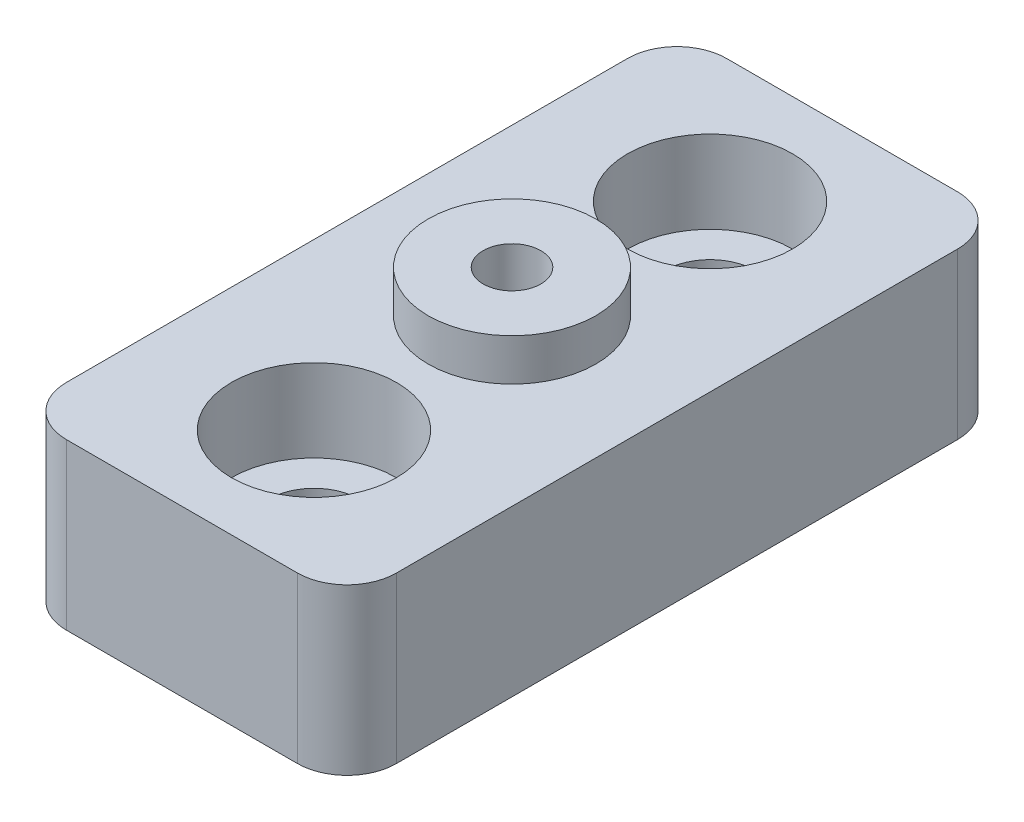
ISO-10303-21;
HEADER;
FILE_DESCRIPTION(('STEP AP214'),'2;1');
FILE_NAME('part.step','',(''),(''),'','','');
FILE_SCHEMA(('AUTOMOTIVE_DESIGN { 1 0 10303 214 1 1 1 1 }'));
ENDSEC;
DATA;
#1=APPLICATION_CONTEXT('core data for automotive mechanical design processes');
#2=APPLICATION_PROTOCOL_DEFINITION('international standard','automotive_design',2000,#1);
#3=PRODUCT_CONTEXT('',#1,'mechanical');
#4=PRODUCT('Part','Part','',(#3));
#5=PRODUCT_RELATED_PRODUCT_CATEGORY('part','',(#4));
#6=PRODUCT_DEFINITION_FORMATION('','',#4);
#7=PRODUCT_DEFINITION_CONTEXT('part definition',#1,'design');
#8=PRODUCT_DEFINITION('design','',#6,#7);
#9=PRODUCT_DEFINITION_SHAPE('','',#8);
#10=(LENGTH_UNIT() NAMED_UNIT(*) SI_UNIT(.MILLI.,.METRE.));
#11=(NAMED_UNIT(*) PLANE_ANGLE_UNIT() SI_UNIT($,.RADIAN.));
#12=(NAMED_UNIT(*) SI_UNIT($,.STERADIAN.) SOLID_ANGLE_UNIT());
#13=UNCERTAINTY_MEASURE_WITH_UNIT(LENGTH_MEASURE(1.E-05),#10,'distance_accuracy_value','');
#14=(GEOMETRIC_REPRESENTATION_CONTEXT(3) GLOBAL_UNCERTAINTY_ASSIGNED_CONTEXT((#13)) GLOBAL_UNIT_ASSIGNED_CONTEXT((#10,
#11,#12)) REPRESENTATION_CONTEXT('',''));
#15=CARTESIAN_POINT('',(0.,0.,0.));
#16=DIRECTION('',(0.,0.,1.));
#17=DIRECTION('',(1.,0.,0.));
#18=AXIS2_PLACEMENT_3D('',#15,#16,#17);
#19=CARTESIAN_POINT('',(10.,10.,-20.));
#20=DIRECTION('',(-1.,0.,0.));
#21=DIRECTION('',(0.,0.,1.));
#22=AXIS2_PLACEMENT_3D('',#19,#20,#21);
#23=PLANE('',#22);
#24=DIRECTION('',(0.,0.,-1.));
#25=VECTOR('',#24,1.);
#26=CARTESIAN_POINT('',(10.,10.,-20.));
#27=LINE('',#26,#25);
#28=CARTESIAN_POINT('',(10.,10.,17.));
#29=VERTEX_POINT('',#28);
#30=CARTESIAN_POINT('',(10.,10.,-17.));
#31=VERTEX_POINT('',#30);
#32=EDGE_CURVE('E201',#29,#31,#27,.T.);
#33=ORIENTED_EDGE('',*,*,#32,.F.);
#34=DIRECTION('',(0.,-1.,0.));
#35=VECTOR('',#34,1.);
#36=CARTESIAN_POINT('',(10.,10.,17.));
#37=LINE('',#36,#35);
#38=CARTESIAN_POINT('',(10.,0.,17.));
#39=VERTEX_POINT('',#38);
#40=EDGE_CURVE('E258',#29,#39,#37,.T.);
#41=ORIENTED_EDGE('',*,*,#40,.T.);
#42=DIRECTION('',(0.,0.,-1.));
#43=VECTOR('',#42,1.);
#44=CARTESIAN_POINT('',(10.,0.,-20.));
#45=LINE('',#44,#43);
#46=CARTESIAN_POINT('',(10.,0.,-17.));
#47=VERTEX_POINT('',#46);
#48=EDGE_CURVE('E179',#39,#47,#45,.T.);
#49=ORIENTED_EDGE('',*,*,#48,.T.);
#50=DIRECTION('',(0.,-1.,0.));
#51=VECTOR('',#50,1.);
#52=CARTESIAN_POINT('',(10.,10.,-17.));
#53=LINE('',#52,#51);
#54=EDGE_CURVE('E256',#47,#31,#53,.F.);
#55=ORIENTED_EDGE('',*,*,#54,.T.);
#56=EDGE_LOOP('',(#33,#41,#49,#55));
#57=FACE_BOUND('',#56,.T.);
#58=ADVANCED_FACE('F33',(#57),#23,.F.);
#59=CARTESIAN_POINT('',(-10.,10.,-20.));
#60=DIRECTION('',(0.,0.,1.));
#61=DIRECTION('',(1.,0.,0.));
#62=AXIS2_PLACEMENT_3D('',#59,#60,#61);
#63=PLANE('',#62);
#64=DIRECTION('',(-1.,0.,0.));
#65=VECTOR('',#64,1.);
#66=CARTESIAN_POINT('',(-10.,0.,-20.));
#67=LINE('',#66,#65);
#68=CARTESIAN_POINT('',(7.,0.,-20.));
#69=VERTEX_POINT('',#68);
#70=CARTESIAN_POINT('',(-7.,0.,-20.));
#71=VERTEX_POINT('',#70);
#72=EDGE_CURVE('E214',#69,#71,#67,.T.);
#73=ORIENTED_EDGE('',*,*,#72,.T.);
#74=DIRECTION('',(0.,-1.,0.));
#75=VECTOR('',#74,1.);
#76=CARTESIAN_POINT('',(-7.,10.,-20.));
#77=LINE('',#76,#75);
#78=CARTESIAN_POINT('',(-7.,10.,-20.));
#79=VERTEX_POINT('',#78);
#80=EDGE_CURVE('E11',#71,#79,#77,.F.);
#81=ORIENTED_EDGE('',*,*,#80,.T.);
#82=DIRECTION('',(-1.,0.,0.));
#83=VECTOR('',#82,1.);
#84=CARTESIAN_POINT('',(-10.,10.,-20.));
#85=LINE('',#84,#83);
#86=CARTESIAN_POINT('',(7.,10.,-20.));
#87=VERTEX_POINT('',#86);
#88=EDGE_CURVE('E203',#87,#79,#85,.T.);
#89=ORIENTED_EDGE('',*,*,#88,.F.);
#90=DIRECTION('',(0.,-1.,0.));
#91=VECTOR('',#90,1.);
#92=CARTESIAN_POINT('',(7.,10.,-20.));
#93=LINE('',#92,#91);
#94=EDGE_CURVE('E41',#87,#69,#93,.T.);
#95=ORIENTED_EDGE('',*,*,#94,.T.);
#96=EDGE_LOOP('',(#73,#81,#89,#95));
#97=FACE_BOUND('',#96,.T.);
#98=ADVANCED_FACE('F263',(#97),#63,.F.);
#99=CARTESIAN_POINT('',(-10.,10.,-20.));
#100=DIRECTION('',(1.,0.,0.));
#101=DIRECTION('',(0.,0.,-1.));
#102=AXIS2_PLACEMENT_3D('',#99,#100,#101);
#103=PLANE('',#102);
#104=DIRECTION('',(0.,0.,1.));
#105=VECTOR('',#104,1.);
#106=CARTESIAN_POINT('',(-10.,0.,-20.));
#107=LINE('',#106,#105);
#108=CARTESIAN_POINT('',(-10.,0.,-17.));
#109=VERTEX_POINT('',#108);
#110=CARTESIAN_POINT('',(-9.99999999999999,0.,17.));
#111=VERTEX_POINT('',#110);
#112=EDGE_CURVE('E216',#109,#111,#107,.T.);
#113=ORIENTED_EDGE('',*,*,#112,.T.);
#114=DIRECTION('',(0.,-1.,0.));
#115=VECTOR('',#114,1.);
#116=CARTESIAN_POINT('',(-9.99999999999999,10.,17.));
#117=LINE('',#116,#115);
#118=CARTESIAN_POINT('',(-9.99999999999999,10.,17.));
#119=VERTEX_POINT('',#118);
#120=EDGE_CURVE('E247',#111,#119,#117,.F.);
#121=ORIENTED_EDGE('',*,*,#120,.T.);
#122=DIRECTION('',(0.,0.,1.));
#123=VECTOR('',#122,1.);
#124=CARTESIAN_POINT('',(-10.,10.,-20.));
#125=LINE('',#124,#123);
#126=CARTESIAN_POINT('',(-10.,10.,-17.));
#127=VERTEX_POINT('',#126);
#128=EDGE_CURVE('E206',#127,#119,#125,.T.);
#129=ORIENTED_EDGE('',*,*,#128,.F.);
#130=DIRECTION('',(0.,-1.,0.));
#131=VECTOR('',#130,1.);
#132=CARTESIAN_POINT('',(-10.,10.,-17.));
#133=LINE('',#132,#131);
#134=EDGE_CURVE('E244',#127,#109,#133,.T.);
#135=ORIENTED_EDGE('',*,*,#134,.T.);
#136=EDGE_LOOP('',(#113,#121,#129,#135));
#137=FACE_BOUND('',#136,.T.);
#138=ADVANCED_FACE('F276',(#137),#103,.F.);
#139=CARTESIAN_POINT('',(-9.99999999999999,10.,20.));
#140=DIRECTION('',(0.,0.,-1.));
#141=DIRECTION('',(-1.,0.,0.));
#142=AXIS2_PLACEMENT_3D('',#139,#140,#141);
#143=PLANE('',#142);
#144=DIRECTION('',(1.,0.,0.));
#145=VECTOR('',#144,1.);
#146=CARTESIAN_POINT('',(-9.99999999999999,10.,20.));
#147=LINE('',#146,#145);
#148=CARTESIAN_POINT('',(-7.,10.,20.));
#149=VERTEX_POINT('',#148);
#150=CARTESIAN_POINT('',(7.00000000000001,10.,20.));
#151=VERTEX_POINT('',#150);
#152=EDGE_CURVE('E209',#149,#151,#147,.T.);
#153=ORIENTED_EDGE('',*,*,#152,.F.);
#154=DIRECTION('',(0.,-1.,0.));
#155=VECTOR('',#154,1.);
#156=CARTESIAN_POINT('',(-7.,10.,20.));
#157=LINE('',#156,#155);
#158=CARTESIAN_POINT('',(-7.,0.,20.));
#159=VERTEX_POINT('',#158);
#160=EDGE_CURVE('E233',#149,#159,#157,.T.);
#161=ORIENTED_EDGE('',*,*,#160,.T.);
#162=DIRECTION('',(1.,0.,0.));
#163=VECTOR('',#162,1.);
#164=CARTESIAN_POINT('',(-9.99999999999999,0.,20.));
#165=LINE('',#164,#163);
#166=CARTESIAN_POINT('',(7.00000000000001,0.,20.));
#167=VERTEX_POINT('',#166);
#168=EDGE_CURVE('E204',#159,#167,#165,.T.);
#169=ORIENTED_EDGE('',*,*,#168,.T.);
#170=DIRECTION('',(0.,-1.,0.));
#171=VECTOR('',#170,1.);
#172=CARTESIAN_POINT('',(7.00000000000001,10.,20.));
#173=LINE('',#172,#171);
#174=EDGE_CURVE('E231',#167,#151,#173,.F.);
#175=ORIENTED_EDGE('',*,*,#174,.T.);
#176=EDGE_LOOP('',(#153,#161,#169,#175));
#177=FACE_BOUND('',#176,.T.);
#178=ADVANCED_FACE('F285',(#177),#143,.F.);
#179=CARTESIAN_POINT('',(0.,10.,0.));
#180=DIRECTION('',(0.,1.,0.));
#181=DIRECTION('',(0.,0.,1.));
#182=AXIS2_PLACEMENT_3D('',#179,#180,#181);
#183=PLANE('',#182);
#184=CARTESIAN_POINT('',(0.,10.,12.));
#185=DIRECTION('',(0.,1.,0.));
#186=DIRECTION('',(0.,0.,1.));
#187=AXIS2_PLACEMENT_3D('',#184,#185,#186);
#188=CIRCLE('',#187,5.);
#189=CARTESIAN_POINT('',(0.,10.,17.));
#190=VERTEX_POINT('',#189);
#191=EDGE_CURVE('E532',#190,#190,#188,.T.);
#192=ORIENTED_EDGE('',*,*,#191,.F.);
#193=EDGE_LOOP('',(#192));
#194=FACE_BOUND('',#193,.T.);
#195=CARTESIAN_POINT('',(0.,10.,-12.));
#196=DIRECTION('',(0.,1.,0.));
#197=DIRECTION('',(0.,0.,1.));
#198=AXIS2_PLACEMENT_3D('',#195,#196,#197);
#199=CIRCLE('',#198,5.);
#200=CARTESIAN_POINT('',(0.,10.,-7.));
#201=VERTEX_POINT('',#200);
#202=EDGE_CURVE('E229',#201,#201,#199,.T.);
#203=ORIENTED_EDGE('',*,*,#202,.F.);
#204=EDGE_LOOP('',(#203));
#205=FACE_BOUND('',#204,.T.);
#206=CARTESIAN_POINT('',(0.,10.,0.));
#207=DIRECTION('',(0.,1.,0.));
#208=DIRECTION('',(0.,0.,1.));
#209=AXIS2_PLACEMENT_3D('',#206,#207,#208);
#210=CIRCLE('',#209,5.08);
#211=CARTESIAN_POINT('',(0.,10.,5.08));
#212=VERTEX_POINT('',#211);
#213=EDGE_CURVE('E167',#212,#212,#210,.T.);
#214=ORIENTED_EDGE('',*,*,#213,.F.);
#215=EDGE_LOOP('',(#214));
#216=FACE_BOUND('',#215,.T.);
#217=ORIENTED_EDGE('',*,*,#128,.T.);
#218=CARTESIAN_POINT('',(-7.,10.,17.));
#219=DIRECTION('',(0.,1.,0.));
#220=DIRECTION('',(0.,0.,1.));
#221=AXIS2_PLACEMENT_3D('',#218,#219,#220);
#222=CIRCLE('',#221,3.);
#223=EDGE_CURVE('E254',#119,#149,#222,.T.);
#224=ORIENTED_EDGE('',*,*,#223,.T.);
#225=ORIENTED_EDGE('',*,*,#152,.T.);
#226=CARTESIAN_POINT('',(7.00000000000001,10.,17.));
#227=DIRECTION('',(0.,1.,0.));
#228=DIRECTION('',(0.,0.,1.));
#229=AXIS2_PLACEMENT_3D('',#226,#227,#228);
#230=CIRCLE('',#229,3.);
#231=EDGE_CURVE('E252',#151,#29,#230,.T.);
#232=ORIENTED_EDGE('',*,*,#231,.T.);
#233=ORIENTED_EDGE('',*,*,#32,.T.);
#234=CARTESIAN_POINT('',(7.,10.,-17.));
#235=DIRECTION('',(0.,1.,0.));
#236=DIRECTION('',(0.,0.,1.));
#237=AXIS2_PLACEMENT_3D('',#234,#235,#236);
#238=CIRCLE('',#237,3.);
#239=EDGE_CURVE('E53',#31,#87,#238,.T.);
#240=ORIENTED_EDGE('',*,*,#239,.T.);
#241=ORIENTED_EDGE('',*,*,#88,.T.);
#242=CARTESIAN_POINT('',(-7.,10.,-17.));
#243=DIRECTION('',(0.,1.,0.));
#244=DIRECTION('',(0.,0.,1.));
#245=AXIS2_PLACEMENT_3D('',#242,#243,#244);
#246=CIRCLE('',#245,3.);
#247=EDGE_CURVE('E250',#79,#127,#246,.T.);
#248=ORIENTED_EDGE('',*,*,#247,.T.);
#249=EDGE_LOOP('',(#217,#224,#225,#232,#233,#240,#241,#248));
#250=FACE_BOUND('',#249,.T.);
#251=ADVANCED_FACE('F279',(#194,#205,#216,#250),#183,.T.);
#252=CARTESIAN_POINT('',(0.,0.,0.));
#253=DIRECTION('',(0.,1.,0.));
#254=DIRECTION('',(0.,0.,1.));
#255=AXIS2_PLACEMENT_3D('',#252,#253,#254);
#256=PLANE('',#255);
#257=CARTESIAN_POINT('',(0.,0.,12.));
#258=DIRECTION('',(0.,1.,0.));
#259=DIRECTION('',(0.,0.,1.));
#260=AXIS2_PLACEMENT_3D('',#257,#258,#259);
#261=CIRCLE('',#260,2.75);
#262=CARTESIAN_POINT('',(0.,0.,14.75));
#263=VERTEX_POINT('',#262);
#264=EDGE_CURVE('E226',#263,#263,#261,.T.);
#265=ORIENTED_EDGE('',*,*,#264,.T.);
#266=EDGE_LOOP('',(#265));
#267=FACE_BOUND('',#266,.T.);
#268=CARTESIAN_POINT('',(0.,0.,-12.));
#269=DIRECTION('',(0.,1.,0.));
#270=DIRECTION('',(0.,0.,1.));
#271=AXIS2_PLACEMENT_3D('',#268,#269,#270);
#272=CIRCLE('',#271,2.75);
#273=CARTESIAN_POINT('',(0.,0.,-9.25));
#274=VERTEX_POINT('',#273);
#275=EDGE_CURVE('E221',#274,#274,#272,.T.);
#276=ORIENTED_EDGE('',*,*,#275,.T.);
#277=EDGE_LOOP('',(#276));
#278=FACE_BOUND('',#277,.T.);
#279=DIRECTION('',(1.,0.,0.));
#280=VECTOR('',#279,1.);
#281=CARTESIAN_POINT('',(0.,0.,2.88964051942574));
#282=LINE('',#281,#280);
#283=CARTESIAN_POINT('',(-1.6683347317517,0.,2.88964051942574));
#284=VERTEX_POINT('',#283);
#285=CARTESIAN_POINT('',(1.6683347317517,0.,2.88964051942574));
#286=VERTEX_POINT('',#285);
#287=EDGE_CURVE('E146',#284,#286,#282,.T.);
#288=ORIENTED_EDGE('',*,*,#287,.T.);
#289=DIRECTION('',(0.5,0.,-0.866025403784438));
#290=VECTOR('',#289,1.);
#291=CARTESIAN_POINT('',(2.50250209762755,0.,1.44482025971287));
#292=LINE('',#291,#290);
#293=CARTESIAN_POINT('',(3.3366694635034,0.,0.));
#294=VERTEX_POINT('',#293);
#295=EDGE_CURVE('E178',#286,#294,#292,.T.);
#296=ORIENTED_EDGE('',*,*,#295,.T.);
#297=DIRECTION('',(-0.5,0.,-0.866025403784439));
#298=VECTOR('',#297,1.);
#299=CARTESIAN_POINT('',(2.50250209762755,0.,-1.44482025971287));
#300=LINE('',#299,#298);
#301=CARTESIAN_POINT('',(1.6683347317517,0.,-2.88964051942574));
#302=VERTEX_POINT('',#301);
#303=EDGE_CURVE('E140',#294,#302,#300,.T.);
#304=ORIENTED_EDGE('',*,*,#303,.T.);
#305=DIRECTION('',(-1.,0.,0.));
#306=VECTOR('',#305,1.);
#307=CARTESIAN_POINT('',(0.,0.,-2.88964051942574));
#308=LINE('',#307,#306);
#309=CARTESIAN_POINT('',(-1.6683347317517,0.,-2.88964051942574));
#310=VERTEX_POINT('',#309);
#311=EDGE_CURVE('E197',#302,#310,#308,.T.);
#312=ORIENTED_EDGE('',*,*,#311,.T.);
#313=DIRECTION('',(-0.5,0.,0.866025403784439));
#314=VECTOR('',#313,1.);
#315=CARTESIAN_POINT('',(-2.50250209762755,0.,-1.44482025971287));
#316=LINE('',#315,#314);
#317=CARTESIAN_POINT('',(-3.3366694635034,0.,0.));
#318=VERTEX_POINT('',#317);
#319=EDGE_CURVE('E194',#310,#318,#316,.T.);
#320=ORIENTED_EDGE('',*,*,#319,.T.);
#321=DIRECTION('',(0.5,0.,0.866025403784439));
#322=VECTOR('',#321,1.);
#323=CARTESIAN_POINT('',(-2.50250209762755,0.,1.44482025971287));
#324=LINE('',#323,#322);
#325=EDGE_CURVE('E191',#318,#284,#324,.T.);
#326=ORIENTED_EDGE('',*,*,#325,.T.);
#327=EDGE_LOOP('',(#288,#296,#304,#312,#320,#326));
#328=FACE_BOUND('',#327,.T.);
#329=ORIENTED_EDGE('',*,*,#168,.F.);
#330=CARTESIAN_POINT('',(-7.,0.,17.));
#331=DIRECTION('',(0.,1.,0.));
#332=DIRECTION('',(0.,0.,1.));
#333=AXIS2_PLACEMENT_3D('',#330,#331,#332);
#334=CIRCLE('',#333,3.);
#335=EDGE_CURVE('E242',#159,#111,#334,.F.);
#336=ORIENTED_EDGE('',*,*,#335,.T.);
#337=ORIENTED_EDGE('',*,*,#112,.F.);
#338=CARTESIAN_POINT('',(-7.,0.,-17.));
#339=DIRECTION('',(0.,1.,0.));
#340=DIRECTION('',(0.,0.,1.));
#341=AXIS2_PLACEMENT_3D('',#338,#339,#340);
#342=CIRCLE('',#341,3.);
#343=EDGE_CURVE('E238',#109,#71,#342,.F.);
#344=ORIENTED_EDGE('',*,*,#343,.T.);
#345=ORIENTED_EDGE('',*,*,#72,.F.);
#346=CARTESIAN_POINT('',(7.,0.,-17.));
#347=DIRECTION('',(0.,1.,0.));
#348=DIRECTION('',(0.,0.,1.));
#349=AXIS2_PLACEMENT_3D('',#346,#347,#348);
#350=CIRCLE('',#349,3.);
#351=EDGE_CURVE('E236',#69,#47,#350,.F.);
#352=ORIENTED_EDGE('',*,*,#351,.T.);
#353=ORIENTED_EDGE('',*,*,#48,.F.);
#354=CARTESIAN_POINT('',(7.00000000000001,0.,17.));
#355=DIRECTION('',(0.,1.,0.));
#356=DIRECTION('',(0.,0.,1.));
#357=AXIS2_PLACEMENT_3D('',#354,#355,#356);
#358=CIRCLE('',#357,3.);
#359=EDGE_CURVE('E240',#39,#167,#358,.F.);
#360=ORIENTED_EDGE('',*,*,#359,.T.);
#361=EDGE_LOOP('',(#329,#336,#337,#344,#345,#352,#353,#360));
#362=FACE_BOUND('',#361,.T.);
#363=ADVANCED_FACE('F267',(#267,#278,#328,#362),#256,.F.);
#364=CARTESIAN_POINT('',(1.58771324027147,8.,2.75));
#365=DIRECTION('',(0.865893503920754,0.0174524064372835,0.499923847578196));
#366=DIRECTION('',(0.5,0.,-0.866025403784438));
#367=AXIS2_PLACEMENT_3D('',#364,#365,#366);
#368=PLANE('',#367);
#369=DIRECTION('',(0.5,0.,-0.866025403784438));
#370=VECTOR('',#369,1.);
#371=CARTESIAN_POINT('',(1.58771324027147,8.,2.75));
#372=LINE('',#371,#370);
#373=CARTESIAN_POINT('',(1.58771324027147,8.,2.75));
#374=VERTEX_POINT('',#373);
#375=CARTESIAN_POINT('',(3.17542648054294,8.,0.));
#376=VERTEX_POINT('',#375);
#377=EDGE_CURVE('E153',#374,#376,#372,.T.);
#378=ORIENTED_EDGE('',*,*,#377,.T.);
#379=DIRECTION('',(-0.020151280167158,0.999796942337605,0.));
#380=VECTOR('',#379,1.);
#381=CARTESIAN_POINT('',(3.17478175132995,8.03198795761071,0.));
#382=LINE('',#381,#380);
#383=EDGE_CURVE('E134',#294,#376,#382,.T.);
#384=ORIENTED_EDGE('',*,*,#383,.F.);
#385=ORIENTED_EDGE('',*,*,#295,.F.);
#386=DIRECTION('',(-0.010075640083579,0.999796942337605,-0.0174515205435364));
#387=VECTOR('',#386,1.);
#388=CARTESIAN_POINT('',(1.58739087566497,8.03198795761071,2.74944164812298));
#389=LINE('',#388,#387);
#390=EDGE_CURVE('E160',#286,#374,#389,.T.);
#391=ORIENTED_EDGE('',*,*,#390,.T.);
#392=EDGE_LOOP('',(#378,#384,#385,#391));
#393=FACE_BOUND('',#392,.T.);
#394=ADVANCED_FACE('F159',(#393),#368,.F.);
#395=CARTESIAN_POINT('',(-1.58771324027147,8.,2.75));
#396=DIRECTION('',(0.,0.0174524064372835,0.999847695156391));
#397=DIRECTION('',(0.,-0.999847695156391,0.0174524064372835));
#398=AXIS2_PLACEMENT_3D('',#395,#396,#397);
#399=PLANE('',#398);
#400=DIRECTION('',(1.,0.,0.));
#401=VECTOR('',#400,1.);
#402=CARTESIAN_POINT('',(-1.58771324027147,8.,2.75));
#403=LINE('',#402,#401);
#404=CARTESIAN_POINT('',(-1.58771324027147,8.,2.75));
#405=VERTEX_POINT('',#404);
#406=EDGE_CURVE('E176',#405,#374,#403,.T.);
#407=ORIENTED_EDGE('',*,*,#406,.T.);
#408=ORIENTED_EDGE('',*,*,#390,.F.);
#409=ORIENTED_EDGE('',*,*,#287,.F.);
#410=DIRECTION('',(0.010075640083579,0.999796942337605,-0.0174515205435363));
#411=VECTOR('',#410,1.);
#412=CARTESIAN_POINT('',(-1.58739087566497,8.03198795761071,2.74944164812298));
#413=LINE('',#412,#411);
#414=EDGE_CURVE('E180',#284,#405,#413,.T.);
#415=ORIENTED_EDGE('',*,*,#414,.T.);
#416=EDGE_LOOP('',(#407,#408,#409,#415));
#417=FACE_BOUND('',#416,.T.);
#418=ADVANCED_FACE('F453',(#417),#399,.F.);
#419=CARTESIAN_POINT('',(-3.17542648054294,8.,0.));
#420=DIRECTION('',(-0.865893503920754,0.0174524064372835,0.499923847578196));
#421=DIRECTION('',(0.5,0.,0.866025403784439));
#422=AXIS2_PLACEMENT_3D('',#419,#420,#421);
#423=PLANE('',#422);
#424=DIRECTION('',(0.5,0.,0.866025403784439));
#425=VECTOR('',#424,1.);
#426=CARTESIAN_POINT('',(-3.17542648054294,8.,0.));
#427=LINE('',#426,#425);
#428=CARTESIAN_POINT('',(-3.17542648054294,8.,0.));
#429=VERTEX_POINT('',#428);
#430=EDGE_CURVE('E173',#429,#405,#427,.T.);
#431=ORIENTED_EDGE('',*,*,#430,.T.);
#432=ORIENTED_EDGE('',*,*,#414,.F.);
#433=ORIENTED_EDGE('',*,*,#325,.F.);
#434=DIRECTION('',(0.020151280167158,0.999796942337605,0.));
#435=VECTOR('',#434,1.);
#436=CARTESIAN_POINT('',(-3.17478175132995,8.03198795761071,0.));
#437=LINE('',#436,#435);
#438=EDGE_CURVE('E185',#318,#429,#437,.T.);
#439=ORIENTED_EDGE('',*,*,#438,.T.);
#440=EDGE_LOOP('',(#431,#432,#433,#439));
#441=FACE_BOUND('',#440,.T.);
#442=ADVANCED_FACE('F444',(#441),#423,.F.);
#443=CARTESIAN_POINT('',(-1.58771324027147,8.,-2.75));
#444=DIRECTION('',(-0.865893503920754,0.0174524064372835,-0.499923847578196));
#445=DIRECTION('',(-0.5,0.,0.866025403784439));
#446=AXIS2_PLACEMENT_3D('',#443,#444,#445);
#447=PLANE('',#446);
#448=DIRECTION('',(-0.5,0.,0.866025403784439));
#449=VECTOR('',#448,1.);
#450=CARTESIAN_POINT('',(-1.58771324027147,8.,-2.75));
#451=LINE('',#450,#449);
#452=CARTESIAN_POINT('',(-1.58771324027147,8.,-2.75));
#453=VERTEX_POINT('',#452);
#454=EDGE_CURVE('E170',#453,#429,#451,.T.);
#455=ORIENTED_EDGE('',*,*,#454,.T.);
#456=ORIENTED_EDGE('',*,*,#438,.F.);
#457=ORIENTED_EDGE('',*,*,#319,.F.);
#458=DIRECTION('',(0.010075640083579,0.999796942337605,0.0174515205435363));
#459=VECTOR('',#458,1.);
#460=CARTESIAN_POINT('',(-1.58739087566497,8.03198795761071,-2.74944164812298));
#461=LINE('',#460,#459);
#462=EDGE_CURVE('E183',#310,#453,#461,.T.);
#463=ORIENTED_EDGE('',*,*,#462,.T.);
#464=EDGE_LOOP('',(#455,#456,#457,#463));
#465=FACE_BOUND('',#464,.T.);
#466=ADVANCED_FACE('F435',(#465),#447,.F.);
#467=CARTESIAN_POINT('',(1.58771324027147,8.,-2.75));
#468=DIRECTION('',(0.,0.0174524064372835,-0.999847695156391));
#469=DIRECTION('',(0.,0.999847695156391,0.0174524064372835));
#470=AXIS2_PLACEMENT_3D('',#467,#468,#469);
#471=PLANE('',#470);
#472=DIRECTION('',(-1.,0.,0.));
#473=VECTOR('',#472,1.);
#474=CARTESIAN_POINT('',(1.58771324027147,8.,-2.75));
#475=LINE('',#474,#473);
#476=CARTESIAN_POINT('',(1.58771324027147,8.,-2.75));
#477=VERTEX_POINT('',#476);
#478=EDGE_CURVE('E157',#477,#453,#475,.T.);
#479=ORIENTED_EDGE('',*,*,#478,.T.);
#480=ORIENTED_EDGE('',*,*,#462,.F.);
#481=ORIENTED_EDGE('',*,*,#311,.F.);
#482=DIRECTION('',(-0.010075640083579,0.999796942337605,0.0174515205435363));
#483=VECTOR('',#482,1.);
#484=CARTESIAN_POINT('',(1.58739087566497,8.03198795761071,-2.74944164812298));
#485=LINE('',#484,#483);
#486=EDGE_CURVE('E145',#302,#477,#485,.T.);
#487=ORIENTED_EDGE('',*,*,#486,.T.);
#488=EDGE_LOOP('',(#479,#480,#481,#487));
#489=FACE_BOUND('',#488,.T.);
#490=ADVANCED_FACE('F427',(#489),#471,.F.);
#491=CARTESIAN_POINT('',(3.17542648054294,8.,0.));
#492=DIRECTION('',(0.865893503920754,0.0174524064372835,-0.499923847578196));
#493=DIRECTION('',(-0.5,0.,-0.866025403784439));
#494=AXIS2_PLACEMENT_3D('',#491,#492,#493);
#495=PLANE('',#494);
#496=DIRECTION('',(-0.5,0.,-0.866025403784439));
#497=VECTOR('',#496,1.);
#498=CARTESIAN_POINT('',(3.17542648054294,8.,0.));
#499=LINE('',#498,#497);
#500=EDGE_CURVE('E138',#376,#477,#499,.T.);
#501=ORIENTED_EDGE('',*,*,#500,.T.);
#502=ORIENTED_EDGE('',*,*,#486,.F.);
#503=ORIENTED_EDGE('',*,*,#303,.F.);
#504=ORIENTED_EDGE('',*,*,#383,.T.);
#505=EDGE_LOOP('',(#501,#502,#503,#504));
#506=FACE_BOUND('',#505,.T.);
#507=ADVANCED_FACE('F136',(#506),#495,.F.);
#508=CARTESIAN_POINT('',(0.,8.,0.));
#509=DIRECTION('',(0.,1.,0.));
#510=DIRECTION('',(0.,0.,1.));
#511=AXIS2_PLACEMENT_3D('',#508,#509,#510);
#512=PLANE('',#511);
#513=CARTESIAN_POINT('',(0.,8.,0.));
#514=DIRECTION('',(0.,-1.,0.));
#515=DIRECTION('',(0.,0.,-1.));
#516=AXIS2_PLACEMENT_3D('',#513,#514,#515);
#517=CIRCLE('',#516,1.75);
#518=CARTESIAN_POINT('',(0.,8.,-1.75));
#519=VERTEX_POINT('',#518);
#520=EDGE_CURVE('E224',#519,#519,#517,.T.);
#521=ORIENTED_EDGE('',*,*,#520,.F.);
#522=EDGE_LOOP('',(#521));
#523=FACE_BOUND('',#522,.T.);
#524=ORIENTED_EDGE('',*,*,#377,.F.);
#525=ORIENTED_EDGE('',*,*,#406,.F.);
#526=ORIENTED_EDGE('',*,*,#430,.F.);
#527=ORIENTED_EDGE('',*,*,#454,.F.);
#528=ORIENTED_EDGE('',*,*,#478,.F.);
#529=ORIENTED_EDGE('',*,*,#500,.F.);
#530=EDGE_LOOP('',(#524,#525,#526,#527,#528,#529));
#531=FACE_BOUND('',#530,.T.);
#532=ADVANCED_FACE('F151',(#523,#531),#512,.F.);
#533=CARTESIAN_POINT('',(0.,12.54,0.));
#534=DIRECTION('',(0.,-1.,0.));
#535=DIRECTION('',(0.,0.,-1.));
#536=AXIS2_PLACEMENT_3D('',#533,#534,#535);
#537=CYLINDRICAL_SURFACE('',#536,5.08);
#538=CARTESIAN_POINT('',(0.,12.54,0.));
#539=DIRECTION('',(0.,1.,0.));
#540=DIRECTION('',(0.,0.,1.));
#541=AXIS2_PLACEMENT_3D('',#538,#539,#540);
#542=CIRCLE('',#541,5.08);
#543=CARTESIAN_POINT('',(0.,12.54,5.08));
#544=VERTEX_POINT('',#543);
#545=EDGE_CURVE('E161',#544,#544,#542,.T.);
#546=ORIENTED_EDGE('',*,*,#545,.F.);
#547=EDGE_LOOP('',(#546));
#548=FACE_BOUND('',#547,.T.);
#549=ORIENTED_EDGE('',*,*,#213,.T.);
#550=EDGE_LOOP('',(#549));
#551=FACE_BOUND('',#550,.T.);
#552=ADVANCED_FACE('F402',(#548,#551),#537,.T.);
#553=CARTESIAN_POINT('',(0.,12.54,0.));
#554=DIRECTION('',(0.,1.,0.));
#555=DIRECTION('',(0.,0.,1.));
#556=AXIS2_PLACEMENT_3D('',#553,#554,#555);
#557=PLANE('',#556);
#558=CARTESIAN_POINT('',(0.,12.54,0.));
#559=DIRECTION('',(0.,-1.,0.));
#560=DIRECTION('',(0.,0.,-1.));
#561=AXIS2_PLACEMENT_3D('',#558,#559,#560);
#562=CIRCLE('',#561,1.75);
#563=CARTESIAN_POINT('',(0.,12.54,-1.75));
#564=VERTEX_POINT('',#563);
#565=EDGE_CURVE('E164',#564,#564,#562,.T.);
#566=ORIENTED_EDGE('',*,*,#565,.T.);
#567=EDGE_LOOP('',(#566));
#568=FACE_BOUND('',#567,.T.);
#569=ORIENTED_EDGE('',*,*,#545,.T.);
#570=EDGE_LOOP('',(#569));
#571=FACE_BOUND('',#570,.T.);
#572=ADVANCED_FACE('F393',(#568,#571),#557,.T.);
#573=CARTESIAN_POINT('',(0.,12.54,0.));
#574=DIRECTION('',(0.,-1.,0.));
#575=DIRECTION('',(0.,0.,-1.));
#576=AXIS2_PLACEMENT_3D('',#573,#574,#575);
#577=CYLINDRICAL_SURFACE('',#576,1.75);
#578=ORIENTED_EDGE('',*,*,#565,.F.);
#579=EDGE_LOOP('',(#578));
#580=FACE_BOUND('',#579,.T.);
#581=ORIENTED_EDGE('',*,*,#520,.T.);
#582=EDGE_LOOP('',(#581));
#583=FACE_BOUND('',#582,.T.);
#584=ADVANCED_FACE('F384',(#580,#583),#577,.F.);
#585=CARTESIAN_POINT('',(0.,10.,-12.));
#586=DIRECTION('',(0.,1.,0.));
#587=DIRECTION('',(0.,0.,1.));
#588=AXIS2_PLACEMENT_3D('',#585,#586,#587);
#589=CYLINDRICAL_SURFACE('',#588,2.75);
#590=CARTESIAN_POINT('',(0.,5.,-12.));
#591=DIRECTION('',(0.,1.,0.));
#592=DIRECTION('',(0.,0.,1.));
#593=AXIS2_PLACEMENT_3D('',#590,#591,#592);
#594=CIRCLE('',#593,2.75);
#595=CARTESIAN_POINT('',(0.,5.,-9.25));
#596=VERTEX_POINT('',#595);
#597=EDGE_CURVE('E225',#596,#596,#594,.T.);
#598=ORIENTED_EDGE('',*,*,#597,.T.);
#599=EDGE_LOOP('',(#598));
#600=FACE_BOUND('',#599,.T.);
#601=ORIENTED_EDGE('',*,*,#275,.F.);
#602=EDGE_LOOP('',(#601));
#603=FACE_BOUND('',#602,.T.);
#604=ADVANCED_FACE('F375',(#600,#603),#589,.F.);
#605=CARTESIAN_POINT('',(2.74999999999999,5.,-12.));
#606=DIRECTION('',(0.,-1.,0.));
#607=DIRECTION('',(0.,0.,-1.));
#608=AXIS2_PLACEMENT_3D('',#605,#606,#607);
#609=PLANE('',#608);
#610=ORIENTED_EDGE('',*,*,#597,.F.);
#611=EDGE_LOOP('',(#610));
#612=FACE_BOUND('',#611,.T.);
#613=CARTESIAN_POINT('',(0.,5.,-12.));
#614=DIRECTION('',(0.,1.,0.));
#615=DIRECTION('',(0.,0.,1.));
#616=AXIS2_PLACEMENT_3D('',#613,#614,#615);
#617=CIRCLE('',#616,5.);
#618=CARTESIAN_POINT('',(0.,5.,-7.));
#619=VERTEX_POINT('',#618);
#620=EDGE_CURVE('E540',#619,#619,#617,.T.);
#621=ORIENTED_EDGE('',*,*,#620,.T.);
#622=EDGE_LOOP('',(#621));
#623=FACE_BOUND('',#622,.T.);
#624=ADVANCED_FACE('F366',(#612,#623),#609,.F.);
#625=CARTESIAN_POINT('',(0.,10.,-12.));
#626=DIRECTION('',(0.,1.,0.));
#627=DIRECTION('',(0.,0.,1.));
#628=AXIS2_PLACEMENT_3D('',#625,#626,#627);
#629=CYLINDRICAL_SURFACE('',#628,5.);
#630=ORIENTED_EDGE('',*,*,#620,.F.);
#631=EDGE_LOOP('',(#630));
#632=FACE_BOUND('',#631,.T.);
#633=ORIENTED_EDGE('',*,*,#202,.T.);
#634=EDGE_LOOP('',(#633));
#635=FACE_BOUND('',#634,.T.);
#636=ADVANCED_FACE('F357',(#632,#635),#629,.F.);
#637=CARTESIAN_POINT('',(0.,10.,12.));
#638=DIRECTION('',(0.,1.,0.));
#639=DIRECTION('',(0.,0.,1.));
#640=AXIS2_PLACEMENT_3D('',#637,#638,#639);
#641=CYLINDRICAL_SURFACE('',#640,2.75);
#642=CARTESIAN_POINT('',(0.,5.,12.));
#643=DIRECTION('',(0.,1.,0.));
#644=DIRECTION('',(0.,0.,1.));
#645=AXIS2_PLACEMENT_3D('',#642,#643,#644);
#646=CIRCLE('',#645,2.75);
#647=CARTESIAN_POINT('',(0.,5.,14.75));
#648=VERTEX_POINT('',#647);
#649=EDGE_CURVE('E230',#648,#648,#646,.T.);
#650=ORIENTED_EDGE('',*,*,#649,.T.);
#651=EDGE_LOOP('',(#650));
#652=FACE_BOUND('',#651,.T.);
#653=ORIENTED_EDGE('',*,*,#264,.F.);
#654=EDGE_LOOP('',(#653));
#655=FACE_BOUND('',#654,.T.);
#656=ADVANCED_FACE('F348',(#652,#655),#641,.F.);
#657=CARTESIAN_POINT('',(2.75,5.,12.));
#658=DIRECTION('',(0.,-1.,0.));
#659=DIRECTION('',(0.,0.,-1.));
#660=AXIS2_PLACEMENT_3D('',#657,#658,#659);
#661=PLANE('',#660);
#662=ORIENTED_EDGE('',*,*,#649,.F.);
#663=EDGE_LOOP('',(#662));
#664=FACE_BOUND('',#663,.T.);
#665=CARTESIAN_POINT('',(0.,5.,12.));
#666=DIRECTION('',(0.,1.,0.));
#667=DIRECTION('',(0.,0.,1.));
#668=AXIS2_PLACEMENT_3D('',#665,#666,#667);
#669=CIRCLE('',#668,5.);
#670=CARTESIAN_POINT('',(0.,5.,17.));
#671=VERTEX_POINT('',#670);
#672=EDGE_CURVE('E569',#671,#671,#669,.T.);
#673=ORIENTED_EDGE('',*,*,#672,.T.);
#674=EDGE_LOOP('',(#673));
#675=FACE_BOUND('',#674,.T.);
#676=ADVANCED_FACE('F339',(#664,#675),#661,.F.);
#677=CARTESIAN_POINT('',(0.,10.,12.));
#678=DIRECTION('',(0.,1.,0.));
#679=DIRECTION('',(0.,0.,1.));
#680=AXIS2_PLACEMENT_3D('',#677,#678,#679);
#681=CYLINDRICAL_SURFACE('',#680,5.);
#682=ORIENTED_EDGE('',*,*,#672,.F.);
#683=EDGE_LOOP('',(#682));
#684=FACE_BOUND('',#683,.T.);
#685=ORIENTED_EDGE('',*,*,#191,.T.);
#686=EDGE_LOOP('',(#685));
#687=FACE_BOUND('',#686,.T.);
#688=ADVANCED_FACE('F308',(#684,#687),#681,.F.);
#689=CARTESIAN_POINT('',(-7.,10.,17.));
#690=DIRECTION('',(0.,-1.,0.));
#691=DIRECTION('',(0.,0.,-1.));
#692=AXIS2_PLACEMENT_3D('',#689,#690,#691);
#693=CYLINDRICAL_SURFACE('',#692,3.);
#694=ORIENTED_EDGE('',*,*,#223,.F.);
#695=ORIENTED_EDGE('',*,*,#120,.F.);
#696=ORIENTED_EDGE('',*,*,#335,.F.);
#697=ORIENTED_EDGE('',*,*,#160,.F.);
#698=EDGE_LOOP('',(#694,#695,#696,#697));
#699=FACE_BOUND('',#698,.T.);
#700=ADVANCED_FACE('F283',(#699),#693,.T.);
#701=CARTESIAN_POINT('',(7.00000000000001,10.,17.));
#702=DIRECTION('',(0.,-1.,0.));
#703=DIRECTION('',(0.,0.,-1.));
#704=AXIS2_PLACEMENT_3D('',#701,#702,#703);
#705=CYLINDRICAL_SURFACE('',#704,3.);
#706=ORIENTED_EDGE('',*,*,#231,.F.);
#707=ORIENTED_EDGE('',*,*,#174,.F.);
#708=ORIENTED_EDGE('',*,*,#359,.F.);
#709=ORIENTED_EDGE('',*,*,#40,.F.);
#710=EDGE_LOOP('',(#706,#707,#708,#709));
#711=FACE_BOUND('',#710,.T.);
#712=ADVANCED_FACE('F290',(#711),#705,.T.);
#713=CARTESIAN_POINT('',(-7.,10.,-17.));
#714=DIRECTION('',(0.,-1.,0.));
#715=DIRECTION('',(0.,0.,-1.));
#716=AXIS2_PLACEMENT_3D('',#713,#714,#715);
#717=CYLINDRICAL_SURFACE('',#716,3.);
#718=ORIENTED_EDGE('',*,*,#247,.F.);
#719=ORIENTED_EDGE('',*,*,#80,.F.);
#720=ORIENTED_EDGE('',*,*,#343,.F.);
#721=ORIENTED_EDGE('',*,*,#134,.F.);
#722=EDGE_LOOP('',(#718,#719,#720,#721));
#723=FACE_BOUND('',#722,.T.);
#724=ADVANCED_FACE('F273',(#723),#717,.T.);
#725=CARTESIAN_POINT('',(7.,10.,-17.));
#726=DIRECTION('',(0.,-1.,0.));
#727=DIRECTION('',(0.,0.,-1.));
#728=AXIS2_PLACEMENT_3D('',#725,#726,#727);
#729=CYLINDRICAL_SURFACE('',#728,3.);
#730=ORIENTED_EDGE('',*,*,#239,.F.);
#731=ORIENTED_EDGE('',*,*,#54,.F.);
#732=ORIENTED_EDGE('',*,*,#351,.F.);
#733=ORIENTED_EDGE('',*,*,#94,.F.);
#734=EDGE_LOOP('',(#730,#731,#732,#733));
#735=FACE_BOUND('',#734,.T.);
#736=ADVANCED_FACE('F35',(#735),#729,.T.);
#737=CLOSED_SHELL('',(#58,#98,#138,#178,#251,#363,#394,#418,#442,#466,#490,#507,#532,#552,#572,
#584,#604,#624,#636,#656,#676,#688,#700,#712,#724,#736));
#738=MANIFOLD_SOLID_BREP('B2',#737);
#739=ADVANCED_BREP_SHAPE_REPRESENTATION('',(#18,#738),#14);
#740=SHAPE_DEFINITION_REPRESENTATION(#9,#739);
ENDSEC;
END-ISO-10303-21;
